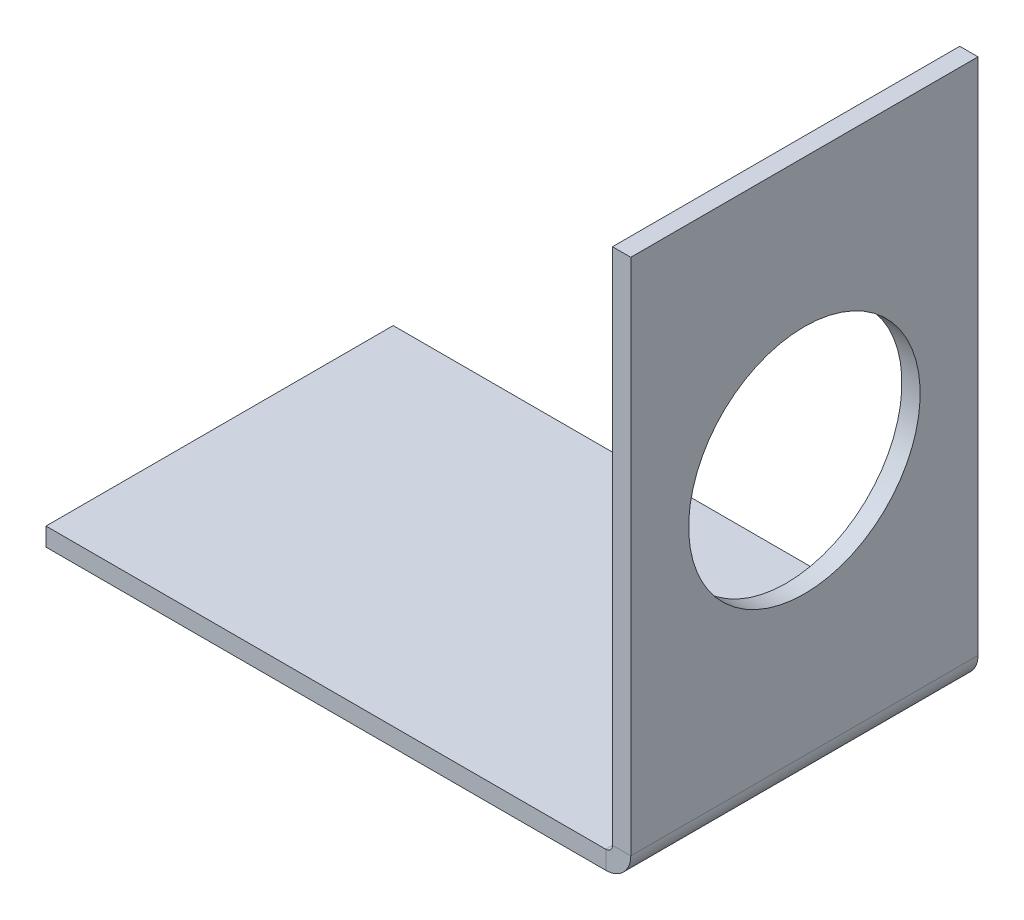
ISO-10303-21;
HEADER;
FILE_DESCRIPTION(('STEP AP214'),'2;1');
FILE_NAME('part.step','',(''),(''),'','','');
FILE_SCHEMA(('AUTOMOTIVE_DESIGN { 1 0 10303 214 1 1 1 1 }'));
ENDSEC;
DATA;
#1=APPLICATION_CONTEXT('core data for automotive mechanical design processes');
#2=APPLICATION_PROTOCOL_DEFINITION('international standard','automotive_design',2000,#1);
#3=PRODUCT_CONTEXT('',#1,'mechanical');
#4=PRODUCT('Part','Part','',(#3));
#5=PRODUCT_RELATED_PRODUCT_CATEGORY('part','',(#4));
#6=PRODUCT_DEFINITION_FORMATION('','',#4);
#7=PRODUCT_DEFINITION_CONTEXT('part definition',#1,'design');
#8=PRODUCT_DEFINITION('design','',#6,#7);
#9=PRODUCT_DEFINITION_SHAPE('','',#8);
#10=(LENGTH_UNIT() NAMED_UNIT(*) SI_UNIT(.MILLI.,.METRE.));
#11=(NAMED_UNIT(*) PLANE_ANGLE_UNIT() SI_UNIT($,.RADIAN.));
#12=(NAMED_UNIT(*) SI_UNIT($,.STERADIAN.) SOLID_ANGLE_UNIT());
#13=UNCERTAINTY_MEASURE_WITH_UNIT(LENGTH_MEASURE(1.E-05),#10,'distance_accuracy_value','');
#14=(GEOMETRIC_REPRESENTATION_CONTEXT(3) GLOBAL_UNCERTAINTY_ASSIGNED_CONTEXT((#13)) GLOBAL_UNIT_ASSIGNED_CONTEXT((#10,
#11,#12)) REPRESENTATION_CONTEXT('',''));
#15=CARTESIAN_POINT('',(0.,0.,0.));
#16=DIRECTION('',(0.,0.,1.));
#17=DIRECTION('',(1.,0.,0.));
#18=AXIS2_PLACEMENT_3D('',#15,#16,#17);
#19=CARTESIAN_POINT('',(-31.,2.,-19.));
#20=DIRECTION('',(0.,0.,1.));
#21=DIRECTION('',(1.,0.,0.));
#22=AXIS2_PLACEMENT_3D('',#19,#20,#21);
#23=PLANE('',#22);
#24=DIRECTION('',(0.,-1.,0.));
#25=VECTOR('',#24,1.);
#26=CARTESIAN_POINT('',(30.2634,2.,-19.));
#27=LINE('',#26,#25);
#28=CARTESIAN_POINT('',(30.2634,2.,-19.));
#29=VERTEX_POINT('',#28);
#30=CARTESIAN_POINT('',(30.2634,0.,-19.));
#31=VERTEX_POINT('',#30);
#32=EDGE_CURVE('E160',#29,#31,#27,.T.);
#33=ORIENTED_EDGE('',*,*,#32,.T.);
#34=DIRECTION('',(-1.,0.,0.));
#35=VECTOR('',#34,1.);
#36=CARTESIAN_POINT('',(-31.,0.,-19.));
#37=LINE('',#36,#35);
#38=CARTESIAN_POINT('',(-31.,0.,-19.));
#39=VERTEX_POINT('',#38);
#40=EDGE_CURVE('E167',#31,#39,#37,.T.);
#41=ORIENTED_EDGE('',*,*,#40,.T.);
#42=DIRECTION('',(0.,-1.,0.));
#43=VECTOR('',#42,1.);
#44=CARTESIAN_POINT('',(-31.,2.,-19.));
#45=LINE('',#44,#43);
#46=CARTESIAN_POINT('',(-31.,2.,-19.));
#47=VERTEX_POINT('',#46);
#48=EDGE_CURVE('E11',#47,#39,#45,.T.);
#49=ORIENTED_EDGE('',*,*,#48,.F.);
#50=DIRECTION('',(-1.,0.,0.));
#51=VECTOR('',#50,1.);
#52=CARTESIAN_POINT('',(-31.,2.,-19.));
#53=LINE('',#52,#51);
#54=EDGE_CURVE('E169',#29,#47,#53,.T.);
#55=ORIENTED_EDGE('',*,*,#54,.F.);
#56=EDGE_LOOP('',(#33,#41,#49,#55));
#57=FACE_BOUND('',#56,.T.);
#58=ADVANCED_FACE('F33',(#57),#23,.F.);
#59=CARTESIAN_POINT('',(-31.,2.,19.));
#60=DIRECTION('',(0.,0.,-1.));
#61=DIRECTION('',(-1.,0.,0.));
#62=AXIS2_PLACEMENT_3D('',#59,#60,#61);
#63=PLANE('',#62);
#64=DIRECTION('',(0.,-1.,0.));
#65=VECTOR('',#64,1.);
#66=CARTESIAN_POINT('',(30.2634,2.,19.));
#67=LINE('',#66,#65);
#68=CARTESIAN_POINT('',(30.2634,2.,19.));
#69=VERTEX_POINT('',#68);
#70=CARTESIAN_POINT('',(30.2634,0.,19.));
#71=VERTEX_POINT('',#70);
#72=EDGE_CURVE('E47',#69,#71,#67,.T.);
#73=ORIENTED_EDGE('',*,*,#72,.F.);
#74=DIRECTION('',(1.,0.,0.));
#75=VECTOR('',#74,1.);
#76=CARTESIAN_POINT('',(-31.,2.,19.));
#77=LINE('',#76,#75);
#78=CARTESIAN_POINT('',(-31.,2.,19.));
#79=VERTEX_POINT('',#78);
#80=EDGE_CURVE('E174',#79,#69,#77,.T.);
#81=ORIENTED_EDGE('',*,*,#80,.F.);
#82=DIRECTION('',(0.,-1.,0.));
#83=VECTOR('',#82,1.);
#84=CARTESIAN_POINT('',(-31.,2.,19.));
#85=LINE('',#84,#83);
#86=CARTESIAN_POINT('',(-31.,0.,19.));
#87=VERTEX_POINT('',#86);
#88=EDGE_CURVE('E40',#79,#87,#85,.T.);
#89=ORIENTED_EDGE('',*,*,#88,.T.);
#90=DIRECTION('',(1.,0.,0.));
#91=VECTOR('',#90,1.);
#92=CARTESIAN_POINT('',(-31.,0.,19.));
#93=LINE('',#92,#91);
#94=EDGE_CURVE('E172',#87,#71,#93,.T.);
#95=ORIENTED_EDGE('',*,*,#94,.T.);
#96=EDGE_LOOP('',(#73,#81,#89,#95));
#97=FACE_BOUND('',#96,.T.);
#98=ADVANCED_FACE('F182',(#97),#63,.F.);
#99=CARTESIAN_POINT('',(31.,2.,19.));
#100=DIRECTION('',(0.,1.,0.));
#101=DIRECTION('',(0.,0.,1.));
#102=AXIS2_PLACEMENT_3D('',#99,#100,#101);
#103=PLANE('',#102);
#104=ORIENTED_EDGE('',*,*,#80,.T.);
#105=DIRECTION('',(0.,0.,-1.));
#106=VECTOR('',#105,1.);
#107=CARTESIAN_POINT('',(30.2634,2.,-19.));
#108=LINE('',#107,#106);
#109=EDGE_CURVE('E54',#29,#69,#108,.F.);
#110=ORIENTED_EDGE('',*,*,#109,.F.);
#111=ORIENTED_EDGE('',*,*,#54,.T.);
#112=DIRECTION('',(0.,0.,1.));
#113=VECTOR('',#112,1.);
#114=CARTESIAN_POINT('',(-31.,2.,-19.));
#115=LINE('',#114,#113);
#116=EDGE_CURVE('E171',#47,#79,#115,.T.);
#117=ORIENTED_EDGE('',*,*,#116,.T.);
#118=EDGE_LOOP('',(#104,#110,#111,#117));
#119=FACE_BOUND('',#118,.T.);
#120=ADVANCED_FACE('F192',(#119),#103,.T.);
#121=CARTESIAN_POINT('',(31.,0.,19.));
#122=DIRECTION('',(0.,1.,0.));
#123=DIRECTION('',(0.,0.,1.));
#124=AXIS2_PLACEMENT_3D('',#121,#122,#123);
#125=PLANE('',#124);
#126=DIRECTION('',(0.,0.,-1.));
#127=VECTOR('',#126,1.);
#128=CARTESIAN_POINT('',(30.2634,0.,-19.));
#129=LINE('',#128,#127);
#130=EDGE_CURVE('E106',#31,#71,#129,.F.);
#131=ORIENTED_EDGE('',*,*,#130,.T.);
#132=ORIENTED_EDGE('',*,*,#94,.F.);
#133=DIRECTION('',(0.,0.,1.));
#134=VECTOR('',#133,1.);
#135=CARTESIAN_POINT('',(-31.,0.,-19.));
#136=LINE('',#135,#134);
#137=EDGE_CURVE('E177',#39,#87,#136,.T.);
#138=ORIENTED_EDGE('',*,*,#137,.F.);
#139=ORIENTED_EDGE('',*,*,#40,.F.);
#140=EDGE_LOOP('',(#131,#132,#138,#139));
#141=FACE_BOUND('',#140,.T.);
#142=ADVANCED_FACE('F187',(#141),#125,.F.);
#143=CARTESIAN_POINT('',(-31.,2.,-19.));
#144=DIRECTION('',(1.,0.,0.));
#145=DIRECTION('',(0.,0.,-1.));
#146=AXIS2_PLACEMENT_3D('',#143,#144,#145);
#147=PLANE('',#146);
#148=ORIENTED_EDGE('',*,*,#137,.T.);
#149=ORIENTED_EDGE('',*,*,#88,.F.);
#150=ORIENTED_EDGE('',*,*,#116,.F.);
#151=ORIENTED_EDGE('',*,*,#48,.T.);
#152=EDGE_LOOP('',(#148,#149,#150,#151));
#153=FACE_BOUND('',#152,.T.);
#154=ADVANCED_FACE('F191',(#153),#147,.F.);
#155=CARTESIAN_POINT('',(30.2634,2.7366,19.));
#156=DIRECTION('',(0.,0.,1.));
#157=DIRECTION('',(1.,0.,0.));
#158=AXIS2_PLACEMENT_3D('',#155,#156,#157);
#159=PLANE('',#158);
#160=DIRECTION('',(1.,0.,0.));
#161=VECTOR('',#160,1.);
#162=CARTESIAN_POINT('',(31.,2.7366,19.));
#163=LINE('',#162,#161);
#164=CARTESIAN_POINT('',(31.,2.7366,19.));
#165=VERTEX_POINT('',#164);
#166=CARTESIAN_POINT('',(33.,2.73659999999999,19.));
#167=VERTEX_POINT('',#166);
#168=EDGE_CURVE('E142',#165,#167,#163,.T.);
#169=ORIENTED_EDGE('',*,*,#168,.F.);
#170=CARTESIAN_POINT('',(30.2634,2.7366,19.));
#171=DIRECTION('',(0.,0.,-1.));
#172=DIRECTION('',(-1.,0.,0.));
#173=AXIS2_PLACEMENT_3D('',#170,#171,#172);
#174=CIRCLE('',#173,0.736600000000004);
#175=EDGE_CURVE('E109',#69,#165,#174,.F.);
#176=ORIENTED_EDGE('',*,*,#175,.F.);
#177=ORIENTED_EDGE('',*,*,#72,.T.);
#178=CARTESIAN_POINT('',(30.2634,2.7366,19.));
#179=DIRECTION('',(0.,0.,-1.));
#180=DIRECTION('',(-1.,0.,0.));
#181=AXIS2_PLACEMENT_3D('',#178,#179,#180);
#182=CIRCLE('',#181,2.7366);
#183=EDGE_CURVE('E159',#71,#167,#182,.F.);
#184=ORIENTED_EDGE('',*,*,#183,.T.);
#185=EDGE_LOOP('',(#169,#176,#177,#184));
#186=FACE_BOUND('',#185,.T.);
#187=ADVANCED_FACE('F204',(#186),#159,.T.);
#188=CARTESIAN_POINT('',(30.2634,2.7366,-19.));
#189=DIRECTION('',(0.,0.,1.));
#190=DIRECTION('',(1.,0.,0.));
#191=AXIS2_PLACEMENT_3D('',#188,#189,#190);
#192=PLANE('',#191);
#193=CARTESIAN_POINT('',(30.2634,2.7366,-19.));
#194=DIRECTION('',(0.,0.,-1.));
#195=DIRECTION('',(-1.,0.,0.));
#196=AXIS2_PLACEMENT_3D('',#193,#194,#195);
#197=CIRCLE('',#196,0.736600000000004);
#198=CARTESIAN_POINT('',(31.,2.7366,-19.));
#199=VERTEX_POINT('',#198);
#200=EDGE_CURVE('E117',#199,#29,#197,.T.);
#201=ORIENTED_EDGE('',*,*,#200,.F.);
#202=DIRECTION('',(1.,0.,0.));
#203=VECTOR('',#202,1.);
#204=CARTESIAN_POINT('',(31.,2.7366,-19.));
#205=LINE('',#204,#203);
#206=CARTESIAN_POINT('',(33.0000000000002,2.73659999999999,-19.));
#207=VERTEX_POINT('',#206);
#208=EDGE_CURVE('E113',#199,#207,#205,.T.);
#209=ORIENTED_EDGE('',*,*,#208,.T.);
#210=CARTESIAN_POINT('',(30.2634,2.7366,-19.));
#211=DIRECTION('',(0.,0.,-1.));
#212=DIRECTION('',(-1.,0.,0.));
#213=AXIS2_PLACEMENT_3D('',#210,#211,#212);
#214=CIRCLE('',#213,2.7366);
#215=EDGE_CURVE('E99',#207,#31,#214,.T.);
#216=ORIENTED_EDGE('',*,*,#215,.T.);
#217=ORIENTED_EDGE('',*,*,#32,.F.);
#218=EDGE_LOOP('',(#201,#209,#216,#217));
#219=FACE_BOUND('',#218,.T.);
#220=ADVANCED_FACE('F115',(#219),#192,.F.);
#221=CARTESIAN_POINT('',(30.2634,2.7366,-19.));
#222=DIRECTION('',(0.,0.,-1.));
#223=DIRECTION('',(1.,0.,0.));
#224=AXIS2_PLACEMENT_3D('',#221,#222,#223);
#225=CYLINDRICAL_SURFACE('',#224,2.7366);
#226=ORIENTED_EDGE('',*,*,#130,.F.);
#227=ORIENTED_EDGE('',*,*,#215,.F.);
#228=DIRECTION('',(0.,0.,1.));
#229=VECTOR('',#228,1.);
#230=CARTESIAN_POINT('',(33.,2.73659999999999,19.));
#231=LINE('',#230,#229);
#232=EDGE_CURVE('E104',#207,#167,#231,.T.);
#233=ORIENTED_EDGE('',*,*,#232,.T.);
#234=ORIENTED_EDGE('',*,*,#183,.F.);
#235=EDGE_LOOP('',(#226,#227,#233,#234));
#236=FACE_BOUND('',#235,.T.);
#237=ADVANCED_FACE('F101',(#236),#225,.T.);
#238=CARTESIAN_POINT('',(30.2634,2.7366,-19.));
#239=DIRECTION('',(0.,0.,-1.));
#240=DIRECTION('',(1.,0.,0.));
#241=AXIS2_PLACEMENT_3D('',#238,#239,#240);
#242=CYLINDRICAL_SURFACE('',#241,0.736600000000004);
#243=ORIENTED_EDGE('',*,*,#109,.T.);
#244=ORIENTED_EDGE('',*,*,#175,.T.);
#245=DIRECTION('',(0.,0.,-1.));
#246=VECTOR('',#245,1.);
#247=CARTESIAN_POINT('',(31.,2.7366,19.));
#248=LINE('',#247,#246);
#249=EDGE_CURVE('E120',#165,#199,#248,.T.);
#250=ORIENTED_EDGE('',*,*,#249,.T.);
#251=ORIENTED_EDGE('',*,*,#200,.T.);
#252=EDGE_LOOP('',(#243,#244,#250,#251));
#253=FACE_BOUND('',#252,.T.);
#254=ADVANCED_FACE('F194',(#253),#242,.F.);
#255=CARTESIAN_POINT('',(33.0000000000002,59.4732,19.));
#256=DIRECTION('',(-1.,0.,0.));
#257=DIRECTION('',(0.,-1.,0.));
#258=AXIS2_PLACEMENT_3D('',#255,#256,#257);
#259=PLANE('',#258);
#260=CARTESIAN_POINT('',(33.0000000000001,30.7366,0.));
#261=DIRECTION('',(1.,0.,0.));
#262=DIRECTION('',(0.,1.,0.));
#263=AXIS2_PLACEMENT_3D('',#260,#261,#262);
#264=CIRCLE('',#263,12.6683364173748);
#265=CARTESIAN_POINT('',(33.0000000000001,43.4049364173748,0.));
#266=VERTEX_POINT('',#265);
#267=EDGE_CURVE('E138',#266,#266,#264,.T.);
#268=ORIENTED_EDGE('',*,*,#267,.F.);
#269=EDGE_LOOP('',(#268));
#270=FACE_BOUND('',#269,.T.);
#271=ORIENTED_EDGE('',*,*,#232,.F.);
#272=DIRECTION('',(0.,1.,0.));
#273=VECTOR('',#272,1.);
#274=CARTESIAN_POINT('',(33.0000000000002,59.4732,-19.));
#275=LINE('',#274,#273);
#276=CARTESIAN_POINT('',(33.0000000000002,59.4732,-19.));
#277=VERTEX_POINT('',#276);
#278=EDGE_CURVE('E123',#207,#277,#275,.T.);
#279=ORIENTED_EDGE('',*,*,#278,.T.);
#280=DIRECTION('',(0.,0.,1.));
#281=VECTOR('',#280,1.);
#282=CARTESIAN_POINT('',(33.0000000000002,59.4732,19.));
#283=LINE('',#282,#281);
#284=CARTESIAN_POINT('',(33.0000000000002,59.4732,19.));
#285=VERTEX_POINT('',#284);
#286=EDGE_CURVE('E129',#277,#285,#283,.T.);
#287=ORIENTED_EDGE('',*,*,#286,.T.);
#288=DIRECTION('',(0.,-1.,0.));
#289=VECTOR('',#288,1.);
#290=CARTESIAN_POINT('',(33.,1.99999999999999,19.));
#291=LINE('',#290,#289);
#292=EDGE_CURVE('E130',#285,#167,#291,.T.);
#293=ORIENTED_EDGE('',*,*,#292,.T.);
#294=EDGE_LOOP('',(#271,#279,#287,#293));
#295=FACE_BOUND('',#294,.T.);
#296=ADVANCED_FACE('F133',(#270,#295),#259,.F.);
#297=CARTESIAN_POINT('',(31.0000000000002,59.4732,19.));
#298=DIRECTION('',(-1.,0.,0.));
#299=DIRECTION('',(0.,-1.,0.));
#300=AXIS2_PLACEMENT_3D('',#297,#298,#299);
#301=PLANE('',#300);
#302=CARTESIAN_POINT('',(31.0000000000001,30.7366,0.));
#303=DIRECTION('',(1.,0.,0.));
#304=DIRECTION('',(0.,1.,0.));
#305=AXIS2_PLACEMENT_3D('',#302,#303,#304);
#306=CIRCLE('',#305,12.6683364173748);
#307=CARTESIAN_POINT('',(31.0000000000002,43.4049364173748,0.));
#308=VERTEX_POINT('',#307);
#309=EDGE_CURVE('E135',#308,#308,#306,.T.);
#310=ORIENTED_EDGE('',*,*,#309,.T.);
#311=EDGE_LOOP('',(#310));
#312=FACE_BOUND('',#311,.T.);
#313=DIRECTION('',(0.,1.,0.));
#314=VECTOR('',#313,1.);
#315=CARTESIAN_POINT('',(31.0000000000002,59.4732,-19.));
#316=LINE('',#315,#314);
#317=CARTESIAN_POINT('',(31.0000000000002,59.4732,-19.));
#318=VERTEX_POINT('',#317);
#319=EDGE_CURVE('E152',#199,#318,#316,.T.);
#320=ORIENTED_EDGE('',*,*,#319,.F.);
#321=ORIENTED_EDGE('',*,*,#249,.F.);
#322=DIRECTION('',(0.,-1.,0.));
#323=VECTOR('',#322,1.);
#324=CARTESIAN_POINT('',(31.,2.,19.));
#325=LINE('',#324,#323);
#326=CARTESIAN_POINT('',(31.0000000000002,59.4732,19.));
#327=VERTEX_POINT('',#326);
#328=EDGE_CURVE('E144',#327,#165,#325,.T.);
#329=ORIENTED_EDGE('',*,*,#328,.F.);
#330=DIRECTION('',(0.,0.,1.));
#331=VECTOR('',#330,1.);
#332=CARTESIAN_POINT('',(31.0000000000002,59.4732,19.));
#333=LINE('',#332,#331);
#334=EDGE_CURVE('E146',#318,#327,#333,.T.);
#335=ORIENTED_EDGE('',*,*,#334,.F.);
#336=EDGE_LOOP('',(#320,#321,#329,#335));
#337=FACE_BOUND('',#336,.T.);
#338=ADVANCED_FACE('F297',(#312,#337),#301,.T.);
#339=CARTESIAN_POINT('',(33.,1.99999999999999,19.));
#340=DIRECTION('',(0.,0.,-1.));
#341=DIRECTION('',(-1.,0.,0.));
#342=AXIS2_PLACEMENT_3D('',#339,#340,#341);
#343=PLANE('',#342);
#344=ORIENTED_EDGE('',*,*,#168,.T.);
#345=ORIENTED_EDGE('',*,*,#292,.F.);
#346=DIRECTION('',(-1.,0.,0.));
#347=VECTOR('',#346,1.);
#348=CARTESIAN_POINT('',(33.0000000000002,59.4732,19.));
#349=LINE('',#348,#347);
#350=EDGE_CURVE('E149',#285,#327,#349,.T.);
#351=ORIENTED_EDGE('',*,*,#350,.T.);
#352=ORIENTED_EDGE('',*,*,#328,.T.);
#353=EDGE_LOOP('',(#344,#345,#351,#352));
#354=FACE_BOUND('',#353,.T.);
#355=ADVANCED_FACE('F202',(#354),#343,.F.);
#356=CARTESIAN_POINT('',(33.0000000000002,59.4732,-19.));
#357=DIRECTION('',(0.,0.,1.));
#358=DIRECTION('',(0.,-1.,0.));
#359=AXIS2_PLACEMENT_3D('',#356,#357,#358);
#360=PLANE('',#359);
#361=ORIENTED_EDGE('',*,*,#208,.F.);
#362=ORIENTED_EDGE('',*,*,#319,.T.);
#363=DIRECTION('',(-1.,0.,0.));
#364=VECTOR('',#363,1.);
#365=CARTESIAN_POINT('',(33.0000000000002,59.4732,-19.));
#366=LINE('',#365,#364);
#367=EDGE_CURVE('E126',#277,#318,#366,.T.);
#368=ORIENTED_EDGE('',*,*,#367,.F.);
#369=ORIENTED_EDGE('',*,*,#278,.F.);
#370=EDGE_LOOP('',(#361,#362,#368,#369));
#371=FACE_BOUND('',#370,.T.);
#372=ADVANCED_FACE('F124',(#371),#360,.F.);
#373=CARTESIAN_POINT('',(33.0000000000002,59.4732,19.));
#374=DIRECTION('',(0.,-1.,0.));
#375=DIRECTION('',(1.,0.,0.));
#376=AXIS2_PLACEMENT_3D('',#373,#374,#375);
#377=PLANE('',#376);
#378=ORIENTED_EDGE('',*,*,#334,.T.);
#379=ORIENTED_EDGE('',*,*,#350,.F.);
#380=ORIENTED_EDGE('',*,*,#286,.F.);
#381=ORIENTED_EDGE('',*,*,#367,.T.);
#382=EDGE_LOOP('',(#378,#379,#380,#381));
#383=FACE_BOUND('',#382,.T.);
#384=ADVANCED_FACE('F327',(#383),#377,.F.);
#385=CARTESIAN_POINT('',(33.0000000000001,30.7366,0.));
#386=DIRECTION('',(-1.,0.,0.));
#387=DIRECTION('',(0.,-1.,0.));
#388=AXIS2_PLACEMENT_3D('',#385,#386,#387);
#389=CYLINDRICAL_SURFACE('',#388,12.6683364173748);
#390=ORIENTED_EDGE('',*,*,#267,.T.);
#391=EDGE_LOOP('',(#390));
#392=FACE_BOUND('',#391,.T.);
#393=ORIENTED_EDGE('',*,*,#309,.F.);
#394=EDGE_LOOP('',(#393));
#395=FACE_BOUND('',#394,.T.);
#396=ADVANCED_FACE('F337',(#392,#395),#389,.F.);
#397=CLOSED_SHELL('',(#58,#98,#120,#142,#154,#187,#220,#237,#254,#296,#338,#355,#372,#384,#396));
#398=MANIFOLD_SOLID_BREP('B2',#397);
#399=ADVANCED_BREP_SHAPE_REPRESENTATION('',(#18,#398),#14);
#400=SHAPE_DEFINITION_REPRESENTATION(#9,#399);
ENDSEC;
END-ISO-10303-21;
